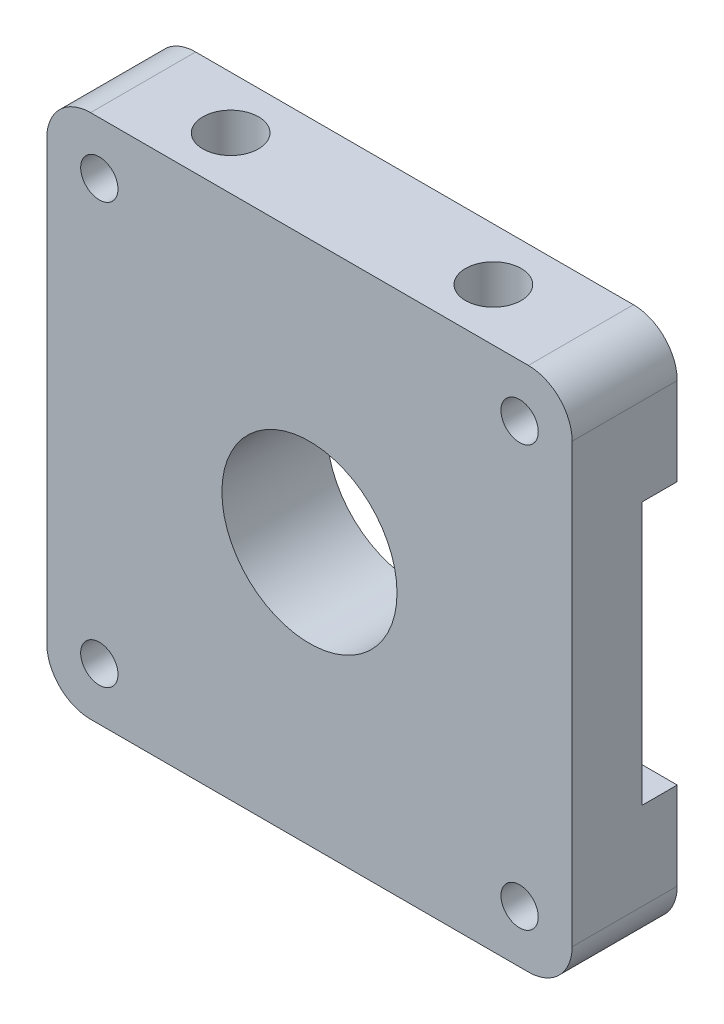
ISO-10303-21;
HEADER;
FILE_DESCRIPTION(('STEP AP214'),'2;1');
FILE_NAME('part.step','',(''),(''),'','','');
FILE_SCHEMA(('AUTOMOTIVE_DESIGN { 1 0 10303 214 1 1 1 1 }'));
ENDSEC;
DATA;
#1=APPLICATION_CONTEXT('core data for automotive mechanical design processes');
#2=APPLICATION_PROTOCOL_DEFINITION('international standard','automotive_design',2000,#1);
#3=PRODUCT_CONTEXT('',#1,'mechanical');
#4=PRODUCT('Part','Part','',(#3));
#5=PRODUCT_RELATED_PRODUCT_CATEGORY('part','',(#4));
#6=PRODUCT_DEFINITION_FORMATION('','',#4);
#7=PRODUCT_DEFINITION_CONTEXT('part definition',#1,'design');
#8=PRODUCT_DEFINITION('design','',#6,#7);
#9=PRODUCT_DEFINITION_SHAPE('','',#8);
#10=(LENGTH_UNIT() NAMED_UNIT(*) SI_UNIT(.MILLI.,.METRE.));
#11=(NAMED_UNIT(*) PLANE_ANGLE_UNIT() SI_UNIT($,.RADIAN.));
#12=(NAMED_UNIT(*) SI_UNIT($,.STERADIAN.) SOLID_ANGLE_UNIT());
#13=UNCERTAINTY_MEASURE_WITH_UNIT(LENGTH_MEASURE(1.E-05),#10,'distance_accuracy_value','');
#14=(GEOMETRIC_REPRESENTATION_CONTEXT(3) GLOBAL_UNCERTAINTY_ASSIGNED_CONTEXT((#13)) GLOBAL_UNIT_ASSIGNED_CONTEXT((#10,
#11,#12)) REPRESENTATION_CONTEXT('',''));
#15=CARTESIAN_POINT('',(0.,0.,0.));
#16=DIRECTION('',(0.,0.,1.));
#17=DIRECTION('',(1.,0.,0.));
#18=AXIS2_PLACEMENT_3D('',#15,#16,#17);
#19=CARTESIAN_POINT('',(9.525,10.16,3.81));
#20=DIRECTION('',(0.,1.,0.));
#21=DIRECTION('',(-1.,0.,0.));
#22=AXIS2_PLACEMENT_3D('',#19,#20,#21);
#23=PLANE('',#22);
#24=CARTESIAN_POINT('',(9.525,10.16,3.81));
#25=DIRECTION('',(0.,1.,0.));
#26=DIRECTION('',(-1.,0.,0.));
#27=AXIS2_PLACEMENT_3D('',#24,#25,#26);
#28=CIRCLE('',#27,2.0193);
#29=CARTESIAN_POINT('',(7.5057,10.16,3.81));
#30=VERTEX_POINT('',#29);
#31=EDGE_CURVE('E20',#30,#30,#28,.T.);
#32=ORIENTED_EDGE('',*,*,#31,.T.);
#33=EDGE_LOOP('',(#32));
#34=FACE_BOUND('',#33,.T.);
#35=ADVANCED_FACE('F17',(#34),#23,.T.);
#36=CARTESIAN_POINT('',(-9.525,10.16,3.81));
#37=DIRECTION('',(0.,1.,0.));
#38=DIRECTION('',(-1.,0.,0.));
#39=AXIS2_PLACEMENT_3D('',#36,#37,#38);
#40=PLANE('',#39);
#41=CARTESIAN_POINT('',(-9.525,10.16,3.81));
#42=DIRECTION('',(0.,1.,0.));
#43=DIRECTION('',(-1.,0.,0.));
#44=AXIS2_PLACEMENT_3D('',#41,#42,#43);
#45=CIRCLE('',#44,2.0193);
#46=CARTESIAN_POINT('',(-11.5443,10.16,3.81));
#47=VERTEX_POINT('',#46);
#48=EDGE_CURVE('E187',#47,#47,#45,.T.);
#49=ORIENTED_EDGE('',*,*,#48,.T.);
#50=EDGE_LOOP('',(#49));
#51=FACE_BOUND('',#50,.T.);
#52=ADVANCED_FACE('F567',(#51),#40,.T.);
#53=CARTESIAN_POINT('',(-9.525,-10.16,3.81));
#54=DIRECTION('',(0.,-1.,0.));
#55=DIRECTION('',(1.,0.,0.));
#56=AXIS2_PLACEMENT_3D('',#53,#54,#55);
#57=PLANE('',#56);
#58=CARTESIAN_POINT('',(-9.525,-10.16,3.81));
#59=DIRECTION('',(0.,-1.,0.));
#60=DIRECTION('',(1.,0.,0.));
#61=AXIS2_PLACEMENT_3D('',#58,#59,#60);
#62=CIRCLE('',#61,2.0193);
#63=CARTESIAN_POINT('',(-7.5057,-10.16,3.81));
#64=VERTEX_POINT('',#63);
#65=EDGE_CURVE('E174',#64,#64,#62,.T.);
#66=ORIENTED_EDGE('',*,*,#65,.T.);
#67=EDGE_LOOP('',(#66));
#68=FACE_BOUND('',#67,.T.);
#69=ADVANCED_FACE('F564',(#68),#57,.T.);
#70=CARTESIAN_POINT('',(9.525,-10.16,3.81));
#71=DIRECTION('',(0.,-1.,0.));
#72=DIRECTION('',(1.,0.,0.));
#73=AXIS2_PLACEMENT_3D('',#70,#71,#72);
#74=PLANE('',#73);
#75=CARTESIAN_POINT('',(9.525,-10.16,3.81));
#76=DIRECTION('',(0.,-1.,0.));
#77=DIRECTION('',(1.,0.,0.));
#78=AXIS2_PLACEMENT_3D('',#75,#76,#77);
#79=CIRCLE('',#78,2.0193);
#80=CARTESIAN_POINT('',(11.5443,-10.16,3.81));
#81=VERTEX_POINT('',#80);
#82=EDGE_CURVE('E170',#81,#81,#79,.T.);
#83=ORIENTED_EDGE('',*,*,#82,.T.);
#84=EDGE_LOOP('',(#83));
#85=FACE_BOUND('',#84,.T.);
#86=ADVANCED_FACE('F561',(#85),#74,.T.);
#87=CARTESIAN_POINT('',(0.,0.,2.54));
#88=DIRECTION('',(0.,0.,-1.));
#89=DIRECTION('',(-1.,0.,0.));
#90=AXIS2_PLACEMENT_3D('',#87,#88,#89);
#91=CYLINDRICAL_SURFACE('',#90,9.525);
#92=CARTESIAN_POINT('',(0.,0.,0.));
#93=DIRECTION('',(0.,0.,-1.));
#94=DIRECTION('',(-1.,0.,0.));
#95=AXIS2_PLACEMENT_3D('',#92,#93,#94);
#96=CIRCLE('',#95,9.525);
#97=CARTESIAN_POINT('',(-7.76635081528961,5.51447368421053,0.));
#98=VERTEX_POINT('',#97);
#99=CARTESIAN_POINT('',(-7.76635081528961,-5.51447368421053,0.));
#100=VERTEX_POINT('',#99);
#101=EDGE_CURVE('E296',#98,#100,#96,.F.);
#102=ORIENTED_EDGE('',*,*,#101,.T.);
#103=DIRECTION('',(0.,0.,-1.));
#104=VECTOR('',#103,1.);
#105=CARTESIAN_POINT('',(-7.76635081528961,-5.51447368421052,2.54));
#106=LINE('',#105,#104);
#107=CARTESIAN_POINT('',(-7.76635081528961,-5.51447368421053,2.54));
#108=VERTEX_POINT('',#107);
#109=EDGE_CURVE('E207',#100,#108,#106,.F.);
#110=ORIENTED_EDGE('',*,*,#109,.T.);
#111=CARTESIAN_POINT('',(0.,0.,2.54));
#112=DIRECTION('',(0.,0.,-1.));
#113=DIRECTION('',(-1.,0.,0.));
#114=AXIS2_PLACEMENT_3D('',#111,#112,#113);
#115=CIRCLE('',#114,9.525);
#116=CARTESIAN_POINT('',(-7.76635081528961,5.51447368421053,2.54));
#117=VERTEX_POINT('',#116);
#118=EDGE_CURVE('E185',#108,#117,#115,.T.);
#119=ORIENTED_EDGE('',*,*,#118,.T.);
#120=DIRECTION('',(0.,0.,-1.));
#121=VECTOR('',#120,1.);
#122=CARTESIAN_POINT('',(-7.76635081528961,5.51447368421053,2.54));
#123=LINE('',#122,#121);
#124=EDGE_CURVE('E158',#117,#98,#123,.T.);
#125=ORIENTED_EDGE('',*,*,#124,.T.);
#126=EDGE_LOOP('',(#102,#110,#119,#125));
#127=FACE_BOUND('',#126,.T.);
#128=ADVANCED_FACE('F557',(#127),#91,.T.);
#129=CARTESIAN_POINT('',(-9.83737769936684,-6.985,2.54));
#130=DIRECTION('',(0.,0.,-1.));
#131=DIRECTION('',(-1.,0.,0.));
#132=AXIS2_PLACEMENT_3D('',#129,#130,#131);
#133=CYLINDRICAL_SURFACE('',#132,2.54);
#134=DIRECTION('',(0.,0.,-1.));
#135=VECTOR('',#134,1.);
#136=CARTESIAN_POINT('',(-9.83737769936684,-9.525,2.54));
#137=LINE('',#136,#135);
#138=CARTESIAN_POINT('',(-9.83737769936684,-9.525,0.));
#139=VERTEX_POINT('',#138);
#140=CARTESIAN_POINT('',(-9.83737769936684,-9.525,2.54));
#141=VERTEX_POINT('',#140);
#142=EDGE_CURVE('E186',#139,#141,#137,.F.);
#143=ORIENTED_EDGE('',*,*,#142,.T.);
#144=CARTESIAN_POINT('',(-9.83737769936684,-6.985,2.54));
#145=DIRECTION('',(0.,0.,-1.));
#146=DIRECTION('',(-1.,0.,0.));
#147=AXIS2_PLACEMENT_3D('',#144,#145,#146);
#148=CIRCLE('',#147,2.54);
#149=EDGE_CURVE('E178',#141,#108,#148,.F.);
#150=ORIENTED_EDGE('',*,*,#149,.T.);
#151=ORIENTED_EDGE('',*,*,#109,.F.);
#152=CARTESIAN_POINT('',(-9.83737769936684,-6.985,0.));
#153=DIRECTION('',(0.,0.,-1.));
#154=DIRECTION('',(-1.,0.,0.));
#155=AXIS2_PLACEMENT_3D('',#152,#153,#154);
#156=CIRCLE('',#155,2.54);
#157=EDGE_CURVE('E294',#100,#139,#156,.T.);
#158=ORIENTED_EDGE('',*,*,#157,.T.);
#159=EDGE_LOOP('',(#143,#150,#151,#158));
#160=FACE_BOUND('',#159,.T.);
#161=ADVANCED_FACE('F554',(#160),#133,.F.);
#162=CARTESIAN_POINT('',(9.83737769936684,-6.985,2.54));
#163=DIRECTION('',(0.,0.,-1.));
#164=DIRECTION('',(-1.,0.,0.));
#165=AXIS2_PLACEMENT_3D('',#162,#163,#164);
#166=CYLINDRICAL_SURFACE('',#165,2.54);
#167=CARTESIAN_POINT('',(9.83737769936684,-6.985,2.54));
#168=DIRECTION('',(0.,0.,-1.));
#169=DIRECTION('',(-1.,0.,0.));
#170=AXIS2_PLACEMENT_3D('',#167,#168,#169);
#171=CIRCLE('',#170,2.54);
#172=CARTESIAN_POINT('',(7.76635081528961,-5.51447368421053,2.54));
#173=VERTEX_POINT('',#172);
#174=CARTESIAN_POINT('',(9.83737769936684,-9.525,2.54));
#175=VERTEX_POINT('',#174);
#176=EDGE_CURVE('E137',#173,#175,#171,.F.);
#177=ORIENTED_EDGE('',*,*,#176,.T.);
#178=DIRECTION('',(0.,0.,-1.));
#179=VECTOR('',#178,1.);
#180=CARTESIAN_POINT('',(9.83737769936684,-9.525,2.54));
#181=LINE('',#180,#179);
#182=CARTESIAN_POINT('',(9.83737769936684,-9.525,0.));
#183=VERTEX_POINT('',#182);
#184=EDGE_CURVE('E173',#175,#183,#181,.T.);
#185=ORIENTED_EDGE('',*,*,#184,.T.);
#186=CARTESIAN_POINT('',(9.83737769936684,-6.985,0.));
#187=DIRECTION('',(0.,0.,-1.));
#188=DIRECTION('',(-1.,0.,0.));
#189=AXIS2_PLACEMENT_3D('',#186,#187,#188);
#190=CIRCLE('',#189,2.54);
#191=CARTESIAN_POINT('',(7.76635081528961,-5.51447368421053,0.));
#192=VERTEX_POINT('',#191);
#193=EDGE_CURVE('E154',#183,#192,#190,.T.);
#194=ORIENTED_EDGE('',*,*,#193,.T.);
#195=DIRECTION('',(0.,0.,-1.));
#196=VECTOR('',#195,1.);
#197=CARTESIAN_POINT('',(7.76635081528961,-5.51447368421052,2.54));
#198=LINE('',#197,#196);
#199=EDGE_CURVE('E151',#173,#192,#198,.T.);
#200=ORIENTED_EDGE('',*,*,#199,.F.);
#201=EDGE_LOOP('',(#177,#185,#194,#200));
#202=FACE_BOUND('',#201,.T.);
#203=ADVANCED_FACE('F152',(#202),#166,.F.);
#204=CARTESIAN_POINT('',(0.,0.,2.54));
#205=DIRECTION('',(0.,0.,-1.));
#206=DIRECTION('',(-1.,0.,0.));
#207=AXIS2_PLACEMENT_3D('',#204,#205,#206);
#208=CYLINDRICAL_SURFACE('',#207,9.525);
#209=CARTESIAN_POINT('',(0.,0.,2.54));
#210=DIRECTION('',(0.,0.,-1.));
#211=DIRECTION('',(-1.,0.,0.));
#212=AXIS2_PLACEMENT_3D('',#209,#210,#211);
#213=CIRCLE('',#212,9.525);
#214=CARTESIAN_POINT('',(7.76635081528961,5.51447368421053,2.54));
#215=VERTEX_POINT('',#214);
#216=EDGE_CURVE('E143',#215,#173,#213,.T.);
#217=ORIENTED_EDGE('',*,*,#216,.T.);
#218=ORIENTED_EDGE('',*,*,#199,.T.);
#219=CARTESIAN_POINT('',(0.,0.,0.));
#220=DIRECTION('',(0.,0.,-1.));
#221=DIRECTION('',(-1.,0.,0.));
#222=AXIS2_PLACEMENT_3D('',#219,#220,#221);
#223=CIRCLE('',#222,9.525);
#224=CARTESIAN_POINT('',(7.76635081528961,5.51447368421053,0.));
#225=VERTEX_POINT('',#224);
#226=EDGE_CURVE('E290',#192,#225,#223,.F.);
#227=ORIENTED_EDGE('',*,*,#226,.T.);
#228=DIRECTION('',(0.,0.,-1.));
#229=VECTOR('',#228,1.);
#230=CARTESIAN_POINT('',(7.76635081528961,5.51447368421053,2.54));
#231=LINE('',#230,#229);
#232=EDGE_CURVE('E159',#225,#215,#231,.F.);
#233=ORIENTED_EDGE('',*,*,#232,.T.);
#234=EDGE_LOOP('',(#217,#218,#227,#233));
#235=FACE_BOUND('',#234,.T.);
#236=ADVANCED_FACE('F162',(#235),#208,.T.);
#237=CARTESIAN_POINT('',(9.83737769936684,6.985,2.54));
#238=DIRECTION('',(0.,0.,-1.));
#239=DIRECTION('',(-1.,0.,0.));
#240=AXIS2_PLACEMENT_3D('',#237,#238,#239);
#241=CYLINDRICAL_SURFACE('',#240,2.54);
#242=CARTESIAN_POINT('',(9.83737769936684,6.985,2.54));
#243=DIRECTION('',(0.,0.,-1.));
#244=DIRECTION('',(-1.,0.,0.));
#245=AXIS2_PLACEMENT_3D('',#242,#243,#244);
#246=CIRCLE('',#245,2.54);
#247=CARTESIAN_POINT('',(9.83737769936684,9.525,2.54));
#248=VERTEX_POINT('',#247);
#249=EDGE_CURVE('E164',#248,#215,#246,.F.);
#250=ORIENTED_EDGE('',*,*,#249,.T.);
#251=ORIENTED_EDGE('',*,*,#232,.F.);
#252=CARTESIAN_POINT('',(9.83737769936684,6.985,0.));
#253=DIRECTION('',(0.,0.,-1.));
#254=DIRECTION('',(-1.,0.,0.));
#255=AXIS2_PLACEMENT_3D('',#252,#253,#254);
#256=CIRCLE('',#255,2.54);
#257=CARTESIAN_POINT('',(9.83737769936684,9.525,0.));
#258=VERTEX_POINT('',#257);
#259=EDGE_CURVE('E287',#225,#258,#256,.T.);
#260=ORIENTED_EDGE('',*,*,#259,.T.);
#261=DIRECTION('',(0.,0.,1.));
#262=VECTOR('',#261,1.);
#263=CARTESIAN_POINT('',(9.83737769936684,9.525,2.54));
#264=LINE('',#263,#262);
#265=EDGE_CURVE('E166',#258,#248,#264,.T.);
#266=ORIENTED_EDGE('',*,*,#265,.T.);
#267=EDGE_LOOP('',(#250,#251,#260,#266));
#268=FACE_BOUND('',#267,.T.);
#269=ADVANCED_FACE('F413',(#268),#241,.F.);
#270=CARTESIAN_POINT('',(-9.83737769936684,6.985,2.54));
#271=DIRECTION('',(0.,0.,-1.));
#272=DIRECTION('',(-1.,0.,0.));
#273=AXIS2_PLACEMENT_3D('',#270,#271,#272);
#274=CYLINDRICAL_SURFACE('',#273,2.54);
#275=ORIENTED_EDGE('',*,*,#124,.F.);
#276=CARTESIAN_POINT('',(-9.83737769936684,6.985,2.54));
#277=DIRECTION('',(0.,0.,-1.));
#278=DIRECTION('',(-1.,0.,0.));
#279=AXIS2_PLACEMENT_3D('',#276,#277,#278);
#280=CIRCLE('',#279,2.54);
#281=CARTESIAN_POINT('',(-9.83737769936684,9.525,2.54));
#282=VERTEX_POINT('',#281);
#283=EDGE_CURVE('E183',#117,#282,#280,.F.);
#284=ORIENTED_EDGE('',*,*,#283,.T.);
#285=DIRECTION('',(0.,0.,1.));
#286=VECTOR('',#285,1.);
#287=CARTESIAN_POINT('',(-9.83737769936684,9.525,2.54));
#288=LINE('',#287,#286);
#289=CARTESIAN_POINT('',(-9.83737769936684,9.525,0.));
#290=VERTEX_POINT('',#289);
#291=EDGE_CURVE('E177',#282,#290,#288,.F.);
#292=ORIENTED_EDGE('',*,*,#291,.T.);
#293=CARTESIAN_POINT('',(-9.83737769936684,6.985,0.));
#294=DIRECTION('',(0.,0.,-1.));
#295=DIRECTION('',(-1.,0.,0.));
#296=AXIS2_PLACEMENT_3D('',#293,#294,#295);
#297=CIRCLE('',#296,2.54);
#298=EDGE_CURVE('E284',#290,#98,#297,.T.);
#299=ORIENTED_EDGE('',*,*,#298,.T.);
#300=EDGE_LOOP('',(#275,#284,#292,#299));
#301=FACE_BOUND('',#300,.T.);
#302=ADVANCED_FACE('F543',(#301),#274,.F.);
#303=CARTESIAN_POINT('',(9.525,10.16,3.81));
#304=DIRECTION('',(0.,1.,0.));
#305=DIRECTION('',(-1.,0.,0.));
#306=AXIS2_PLACEMENT_3D('',#303,#304,#305);
#307=CYLINDRICAL_SURFACE('',#306,2.0193);
#308=ORIENTED_EDGE('',*,*,#31,.F.);
#309=EDGE_LOOP('',(#308));
#310=FACE_BOUND('',#309,.T.);
#311=CARTESIAN_POINT('',(9.525,19.05,3.81));
#312=DIRECTION('',(0.,1.,0.));
#313=DIRECTION('',(-1.,0.,0.));
#314=AXIS2_PLACEMENT_3D('',#311,#312,#313);
#315=CIRCLE('',#314,2.0193);
#316=CARTESIAN_POINT('',(7.5057,19.05,3.81));
#317=VERTEX_POINT('',#316);
#318=EDGE_CURVE('E266',#317,#317,#315,.T.);
#319=ORIENTED_EDGE('',*,*,#318,.T.);
#320=EDGE_LOOP('',(#319));
#321=FACE_BOUND('',#320,.T.);
#322=ADVANCED_FACE('F539',(#310,#321),#307,.F.);
#323=CARTESIAN_POINT('',(-9.525,10.16,3.81));
#324=DIRECTION('',(0.,1.,0.));
#325=DIRECTION('',(-1.,0.,0.));
#326=AXIS2_PLACEMENT_3D('',#323,#324,#325);
#327=CYLINDRICAL_SURFACE('',#326,2.0193);
#328=ORIENTED_EDGE('',*,*,#48,.F.);
#329=EDGE_LOOP('',(#328));
#330=FACE_BOUND('',#329,.T.);
#331=CARTESIAN_POINT('',(-9.525,19.05,3.81));
#332=DIRECTION('',(0.,1.,0.));
#333=DIRECTION('',(-1.,0.,0.));
#334=AXIS2_PLACEMENT_3D('',#331,#332,#333);
#335=CIRCLE('',#334,2.0193);
#336=CARTESIAN_POINT('',(-11.5443,19.05,3.81));
#337=VERTEX_POINT('',#336);
#338=EDGE_CURVE('E263',#337,#337,#335,.T.);
#339=ORIENTED_EDGE('',*,*,#338,.T.);
#340=EDGE_LOOP('',(#339));
#341=FACE_BOUND('',#340,.T.);
#342=ADVANCED_FACE('F536',(#330,#341),#327,.F.);
#343=CARTESIAN_POINT('',(-19.05,-9.525,2.54));
#344=DIRECTION('',(0.,-1.,0.));
#345=DIRECTION('',(0.,0.,-1.));
#346=AXIS2_PLACEMENT_3D('',#343,#344,#345);
#347=PLANE('',#346);
#348=DIRECTION('',(0.,0.,-1.));
#349=VECTOR('',#348,1.);
#350=CARTESIAN_POINT('',(-19.05,-9.525,7.62));
#351=LINE('',#350,#349);
#352=CARTESIAN_POINT('',(-19.05,-9.525,0.));
#353=VERTEX_POINT('',#352);
#354=CARTESIAN_POINT('',(-19.05,-9.525,2.54));
#355=VERTEX_POINT('',#354);
#356=EDGE_CURVE('E337',#353,#355,#351,.F.);
#357=ORIENTED_EDGE('',*,*,#356,.T.);
#358=DIRECTION('',(1.,0.,0.));
#359=VECTOR('',#358,1.);
#360=CARTESIAN_POINT('',(-9.83737769936684,-9.525,2.54));
#361=LINE('',#360,#359);
#362=EDGE_CURVE('E182',#355,#141,#361,.T.);
#363=ORIENTED_EDGE('',*,*,#362,.T.);
#364=ORIENTED_EDGE('',*,*,#142,.F.);
#365=DIRECTION('',(1.,0.,0.));
#366=VECTOR('',#365,1.);
#367=CARTESIAN_POINT('',(0.,-9.525,0.));
#368=LINE('',#367,#366);
#369=EDGE_CURVE('E295',#139,#353,#368,.F.);
#370=ORIENTED_EDGE('',*,*,#369,.T.);
#371=EDGE_LOOP('',(#357,#363,#364,#370));
#372=FACE_BOUND('',#371,.T.);
#373=ADVANCED_FACE('F367',(#372),#347,.F.);
#374=CARTESIAN_POINT('',(-9.83737769936684,-6.985,2.54));
#375=DIRECTION('',(0.,0.,1.));
#376=DIRECTION('',(1.,0.,0.));
#377=AXIS2_PLACEMENT_3D('',#374,#375,#376);
#378=PLANE('',#377);
#379=ORIENTED_EDGE('',*,*,#362,.F.);
#380=DIRECTION('',(0.,1.,0.));
#381=VECTOR('',#380,1.);
#382=CARTESIAN_POINT('',(-19.05,-42.0514213562373,2.54));
#383=LINE('',#382,#381);
#384=CARTESIAN_POINT('',(-19.05,9.525,2.54));
#385=VERTEX_POINT('',#384);
#386=EDGE_CURVE('E348',#355,#385,#383,.T.);
#387=ORIENTED_EDGE('',*,*,#386,.T.);
#388=DIRECTION('',(1.,0.,0.));
#389=VECTOR('',#388,1.);
#390=CARTESIAN_POINT('',(-19.05,9.525,2.54));
#391=LINE('',#390,#389);
#392=EDGE_CURVE('E181',#385,#282,#391,.T.);
#393=ORIENTED_EDGE('',*,*,#392,.T.);
#394=ORIENTED_EDGE('',*,*,#283,.F.);
#395=ORIENTED_EDGE('',*,*,#118,.F.);
#396=ORIENTED_EDGE('',*,*,#149,.F.);
#397=EDGE_LOOP('',(#379,#387,#393,#394,#395,#396));
#398=FACE_BOUND('',#397,.T.);
#399=ADVANCED_FACE('F376',(#398),#378,.F.);
#400=CARTESIAN_POINT('',(-19.05,9.525,2.54));
#401=DIRECTION('',(0.,1.,0.));
#402=DIRECTION('',(0.,0.,1.));
#403=AXIS2_PLACEMENT_3D('',#400,#401,#402);
#404=PLANE('',#403);
#405=ORIENTED_EDGE('',*,*,#291,.F.);
#406=ORIENTED_EDGE('',*,*,#392,.F.);
#407=DIRECTION('',(0.,0.,-1.));
#408=VECTOR('',#407,1.);
#409=CARTESIAN_POINT('',(-19.05,9.525,7.62));
#410=LINE('',#409,#408);
#411=CARTESIAN_POINT('',(-19.05,9.525,0.));
#412=VERTEX_POINT('',#411);
#413=EDGE_CURVE('E343',#385,#412,#410,.T.);
#414=ORIENTED_EDGE('',*,*,#413,.T.);
#415=DIRECTION('',(1.,0.,0.));
#416=VECTOR('',#415,1.);
#417=CARTESIAN_POINT('',(0.,9.525,0.));
#418=LINE('',#417,#416);
#419=EDGE_CURVE('E286',#412,#290,#418,.T.);
#420=ORIENTED_EDGE('',*,*,#419,.T.);
#421=EDGE_LOOP('',(#405,#406,#414,#420));
#422=FACE_BOUND('',#421,.T.);
#423=ADVANCED_FACE('F386',(#422),#404,.F.);
#424=CARTESIAN_POINT('',(-9.525,-10.16,3.81));
#425=DIRECTION('',(0.,-1.,0.));
#426=DIRECTION('',(1.,0.,0.));
#427=AXIS2_PLACEMENT_3D('',#424,#425,#426);
#428=CYLINDRICAL_SURFACE('',#427,2.0193);
#429=ORIENTED_EDGE('',*,*,#65,.F.);
#430=EDGE_LOOP('',(#429));
#431=FACE_BOUND('',#430,.T.);
#432=CARTESIAN_POINT('',(-9.525,-19.05,3.81));
#433=DIRECTION('',(0.,-1.,0.));
#434=DIRECTION('',(1.,0.,0.));
#435=AXIS2_PLACEMENT_3D('',#432,#433,#434);
#436=CIRCLE('',#435,2.0193);
#437=CARTESIAN_POINT('',(-7.5057,-19.05,3.81));
#438=VERTEX_POINT('',#437);
#439=EDGE_CURVE('E252',#438,#438,#436,.T.);
#440=ORIENTED_EDGE('',*,*,#439,.T.);
#441=EDGE_LOOP('',(#440));
#442=FACE_BOUND('',#441,.T.);
#443=ADVANCED_FACE('F525',(#431,#442),#428,.F.);
#444=CARTESIAN_POINT('',(9.525,-10.16,3.81));
#445=DIRECTION('',(0.,-1.,0.));
#446=DIRECTION('',(1.,0.,0.));
#447=AXIS2_PLACEMENT_3D('',#444,#445,#446);
#448=CYLINDRICAL_SURFACE('',#447,2.0193);
#449=ORIENTED_EDGE('',*,*,#82,.F.);
#450=EDGE_LOOP('',(#449));
#451=FACE_BOUND('',#450,.T.);
#452=CARTESIAN_POINT('',(9.525,-19.05,3.81));
#453=DIRECTION('',(0.,-1.,0.));
#454=DIRECTION('',(1.,0.,0.));
#455=AXIS2_PLACEMENT_3D('',#452,#453,#454);
#456=CIRCLE('',#455,2.0193);
#457=CARTESIAN_POINT('',(11.5443,-19.05,3.81));
#458=VERTEX_POINT('',#457);
#459=EDGE_CURVE('E248',#458,#458,#456,.T.);
#460=ORIENTED_EDGE('',*,*,#459,.T.);
#461=EDGE_LOOP('',(#460));
#462=FACE_BOUND('',#461,.T.);
#463=ADVANCED_FACE('F522',(#451,#462),#448,.F.);
#464=CARTESIAN_POINT('',(19.05,-9.525,2.54));
#465=DIRECTION('',(0.,-1.,0.));
#466=DIRECTION('',(0.,0.,-1.));
#467=AXIS2_PLACEMENT_3D('',#464,#465,#466);
#468=PLANE('',#467);
#469=ORIENTED_EDGE('',*,*,#184,.F.);
#470=DIRECTION('',(1.,0.,0.));
#471=VECTOR('',#470,1.);
#472=CARTESIAN_POINT('',(9.83737769936684,-9.525,2.54));
#473=LINE('',#472,#471);
#474=CARTESIAN_POINT('',(19.05,-9.525,2.54));
#475=VERTEX_POINT('',#474);
#476=EDGE_CURVE('E145',#175,#475,#473,.T.);
#477=ORIENTED_EDGE('',*,*,#476,.T.);
#478=DIRECTION('',(0.,0.,1.));
#479=VECTOR('',#478,1.);
#480=CARTESIAN_POINT('',(19.05,-9.525,7.62));
#481=LINE('',#480,#479);
#482=CARTESIAN_POINT('',(19.05,-9.525,0.));
#483=VERTEX_POINT('',#482);
#484=EDGE_CURVE('E322',#475,#483,#481,.F.);
#485=ORIENTED_EDGE('',*,*,#484,.T.);
#486=DIRECTION('',(1.,0.,0.));
#487=VECTOR('',#486,1.);
#488=CARTESIAN_POINT('',(0.,-9.525,0.));
#489=LINE('',#488,#487);
#490=EDGE_CURVE('E293',#483,#183,#489,.F.);
#491=ORIENTED_EDGE('',*,*,#490,.T.);
#492=EDGE_LOOP('',(#469,#477,#485,#491));
#493=FACE_BOUND('',#492,.T.);
#494=ADVANCED_FACE('F407',(#493),#468,.F.);
#495=CARTESIAN_POINT('',(19.05,9.525,2.54));
#496=DIRECTION('',(0.,1.,0.));
#497=DIRECTION('',(0.,0.,1.));
#498=AXIS2_PLACEMENT_3D('',#495,#496,#497);
#499=PLANE('',#498);
#500=DIRECTION('',(0.,0.,1.));
#501=VECTOR('',#500,1.);
#502=CARTESIAN_POINT('',(19.05,9.525,7.62));
#503=LINE('',#502,#501);
#504=CARTESIAN_POINT('',(19.05,9.525,0.));
#505=VERTEX_POINT('',#504);
#506=CARTESIAN_POINT('',(19.05,9.525,2.54));
#507=VERTEX_POINT('',#506);
#508=EDGE_CURVE('E314',#505,#507,#503,.T.);
#509=ORIENTED_EDGE('',*,*,#508,.T.);
#510=DIRECTION('',(1.,0.,0.));
#511=VECTOR('',#510,1.);
#512=CARTESIAN_POINT('',(9.83737769936684,9.525,2.54));
#513=LINE('',#512,#511);
#514=EDGE_CURVE('E297',#507,#248,#513,.F.);
#515=ORIENTED_EDGE('',*,*,#514,.T.);
#516=ORIENTED_EDGE('',*,*,#265,.F.);
#517=DIRECTION('',(1.,0.,0.));
#518=VECTOR('',#517,1.);
#519=CARTESIAN_POINT('',(0.,9.525,0.));
#520=LINE('',#519,#518);
#521=EDGE_CURVE('E289',#258,#505,#520,.T.);
#522=ORIENTED_EDGE('',*,*,#521,.T.);
#523=EDGE_LOOP('',(#509,#515,#516,#522));
#524=FACE_BOUND('',#523,.T.);
#525=ADVANCED_FACE('F423',(#524),#499,.F.);
#526=CARTESIAN_POINT('',(9.83737769936684,6.985,2.54));
#527=DIRECTION('',(0.,0.,1.));
#528=DIRECTION('',(1.,0.,0.));
#529=AXIS2_PLACEMENT_3D('',#526,#527,#528);
#530=PLANE('',#529);
#531=DIRECTION('',(0.,-1.,0.));
#532=VECTOR('',#531,1.);
#533=CARTESIAN_POINT('',(19.05,-42.0514213562373,2.54));
#534=LINE('',#533,#532);
#535=EDGE_CURVE('E242',#507,#475,#534,.T.);
#536=ORIENTED_EDGE('',*,*,#535,.T.);
#537=ORIENTED_EDGE('',*,*,#476,.F.);
#538=ORIENTED_EDGE('',*,*,#176,.F.);
#539=ORIENTED_EDGE('',*,*,#216,.F.);
#540=ORIENTED_EDGE('',*,*,#249,.F.);
#541=ORIENTED_EDGE('',*,*,#514,.F.);
#542=EDGE_LOOP('',(#536,#537,#538,#539,#540,#541));
#543=FACE_BOUND('',#542,.T.);
#544=ADVANCED_FACE('F140',(#543),#530,.F.);
#545=CARTESIAN_POINT('',(0.,-42.0514213562373,0.));
#546=DIRECTION('',(0.,0.,1.));
#547=DIRECTION('',(1.,0.,0.));
#548=AXIS2_PLACEMENT_3D('',#545,#546,#547);
#549=PLANE('',#548);
#550=ORIENTED_EDGE('',*,*,#419,.F.);
#551=DIRECTION('',(0.,1.,0.));
#552=VECTOR('',#551,1.);
#553=CARTESIAN_POINT('',(-19.05,-42.0514213562373,0.));
#554=LINE('',#553,#552);
#555=CARTESIAN_POINT('',(-19.05,15.875,0.));
#556=VERTEX_POINT('',#555);
#557=EDGE_CURVE('E258',#412,#556,#554,.T.);
#558=ORIENTED_EDGE('',*,*,#557,.T.);
#559=CARTESIAN_POINT('',(-15.875,15.875,0.));
#560=DIRECTION('',(0.,0.,-1.));
#561=DIRECTION('',(-1.,0.,0.));
#562=AXIS2_PLACEMENT_3D('',#559,#560,#561);
#563=CIRCLE('',#562,3.17500000000001);
#564=CARTESIAN_POINT('',(-15.875,19.05,0.));
#565=VERTEX_POINT('',#564);
#566=EDGE_CURVE('E259',#565,#556,#563,.F.);
#567=ORIENTED_EDGE('',*,*,#566,.F.);
#568=DIRECTION('',(1.,0.,0.));
#569=VECTOR('',#568,1.);
#570=CARTESIAN_POINT('',(0.,19.05,0.));
#571=LINE('',#570,#569);
#572=CARTESIAN_POINT('',(15.875,19.05,0.));
#573=VERTEX_POINT('',#572);
#574=EDGE_CURVE('E262',#565,#573,#571,.T.);
#575=ORIENTED_EDGE('',*,*,#574,.T.);
#576=CARTESIAN_POINT('',(15.875,15.875,0.));
#577=DIRECTION('',(0.,0.,-1.));
#578=DIRECTION('',(-1.,0.,0.));
#579=AXIS2_PLACEMENT_3D('',#576,#577,#578);
#580=CIRCLE('',#579,3.175);
#581=CARTESIAN_POINT('',(19.05,15.875,0.));
#582=VERTEX_POINT('',#581);
#583=EDGE_CURVE('E238',#582,#573,#580,.F.);
#584=ORIENTED_EDGE('',*,*,#583,.F.);
#585=DIRECTION('',(0.,-1.,0.));
#586=VECTOR('',#585,1.);
#587=CARTESIAN_POINT('',(19.05,-42.0514213562373,0.));
#588=LINE('',#587,#586);
#589=EDGE_CURVE('E316',#582,#505,#588,.T.);
#590=ORIENTED_EDGE('',*,*,#589,.T.);
#591=ORIENTED_EDGE('',*,*,#521,.F.);
#592=ORIENTED_EDGE('',*,*,#259,.F.);
#593=ORIENTED_EDGE('',*,*,#226,.F.);
#594=ORIENTED_EDGE('',*,*,#193,.F.);
#595=ORIENTED_EDGE('',*,*,#490,.F.);
#596=DIRECTION('',(0.,-1.,0.));
#597=VECTOR('',#596,1.);
#598=CARTESIAN_POINT('',(19.05,-42.0514213562373,0.));
#599=LINE('',#598,#597);
#600=CARTESIAN_POINT('',(19.05,-15.875,0.));
#601=VERTEX_POINT('',#600);
#602=EDGE_CURVE('E319',#483,#601,#599,.T.);
#603=ORIENTED_EDGE('',*,*,#602,.T.);
#604=CARTESIAN_POINT('',(15.875,-15.875,0.));
#605=DIRECTION('',(0.,0.,-1.));
#606=DIRECTION('',(-1.,0.,0.));
#607=AXIS2_PLACEMENT_3D('',#604,#605,#606);
#608=CIRCLE('',#607,3.175);
#609=CARTESIAN_POINT('',(15.875,-19.05,0.));
#610=VERTEX_POINT('',#609);
#611=EDGE_CURVE('E243',#610,#601,#608,.F.);
#612=ORIENTED_EDGE('',*,*,#611,.F.);
#613=DIRECTION('',(-1.,0.,0.));
#614=VECTOR('',#613,1.);
#615=CARTESIAN_POINT('',(0.,-19.05,0.));
#616=LINE('',#615,#614);
#617=CARTESIAN_POINT('',(-15.875,-19.05,0.));
#618=VERTEX_POINT('',#617);
#619=EDGE_CURVE('E247',#610,#618,#616,.T.);
#620=ORIENTED_EDGE('',*,*,#619,.T.);
#621=CARTESIAN_POINT('',(-15.875,-15.875,0.));
#622=DIRECTION('',(0.,0.,-1.));
#623=DIRECTION('',(-1.,0.,0.));
#624=AXIS2_PLACEMENT_3D('',#621,#622,#623);
#625=CIRCLE('',#624,3.175);
#626=CARTESIAN_POINT('',(-19.05,-15.875,0.));
#627=VERTEX_POINT('',#626);
#628=EDGE_CURVE('E256',#627,#618,#625,.F.);
#629=ORIENTED_EDGE('',*,*,#628,.F.);
#630=DIRECTION('',(0.,1.,0.));
#631=VECTOR('',#630,1.);
#632=CARTESIAN_POINT('',(-19.05,-42.0514213562373,0.));
#633=LINE('',#632,#631);
#634=EDGE_CURVE('E334',#627,#353,#633,.T.);
#635=ORIENTED_EDGE('',*,*,#634,.T.);
#636=ORIENTED_EDGE('',*,*,#369,.F.);
#637=ORIENTED_EDGE('',*,*,#157,.F.);
#638=ORIENTED_EDGE('',*,*,#101,.F.);
#639=ORIENTED_EDGE('',*,*,#298,.F.);
#640=EDGE_LOOP('',(#550,#558,#567,#575,#584,#590,#591,#592,#593,#594,#595,#603,#612,#620,#629,
#635,#636,#637,#638,#639));
#641=FACE_BOUND('',#640,.T.);
#642=CARTESIAN_POINT('',(0.,0.,0.));
#643=DIRECTION('',(0.,0.,-1.));
#644=DIRECTION('',(-1.,0.,0.));
#645=AXIS2_PLACEMENT_3D('',#642,#643,#644);
#646=CIRCLE('',#645,6.35);
#647=CARTESIAN_POINT('',(-6.35,0.,0.));
#648=VERTEX_POINT('',#647);
#649=EDGE_CURVE('E269',#648,#648,#646,.F.);
#650=ORIENTED_EDGE('',*,*,#649,.T.);
#651=EDGE_LOOP('',(#650));
#652=FACE_BOUND('',#651,.T.);
#653=CARTESIAN_POINT('',(-15.24,15.24,0.));
#654=DIRECTION('',(0.,0.,1.));
#655=DIRECTION('',(1.,0.,0.));
#656=AXIS2_PLACEMENT_3D('',#653,#654,#655);
#657=CIRCLE('',#656,1.35255);
#658=CARTESIAN_POINT('',(-13.88745,15.24,0.));
#659=VERTEX_POINT('',#658);
#660=EDGE_CURVE('E272',#659,#659,#657,.T.);
#661=ORIENTED_EDGE('',*,*,#660,.T.);
#662=EDGE_LOOP('',(#661));
#663=FACE_BOUND('',#662,.T.);
#664=CARTESIAN_POINT('',(15.24,15.24,0.));
#665=DIRECTION('',(0.,0.,1.));
#666=DIRECTION('',(1.,0.,0.));
#667=AXIS2_PLACEMENT_3D('',#664,#665,#666);
#668=CIRCLE('',#667,1.35255);
#669=CARTESIAN_POINT('',(16.59255,15.24,0.));
#670=VERTEX_POINT('',#669);
#671=EDGE_CURVE('E275',#670,#670,#668,.T.);
#672=ORIENTED_EDGE('',*,*,#671,.T.);
#673=EDGE_LOOP('',(#672));
#674=FACE_BOUND('',#673,.T.);
#675=CARTESIAN_POINT('',(15.2400000000003,-15.2399999999997,0.));
#676=DIRECTION('',(0.,0.,1.));
#677=DIRECTION('',(1.,0.,0.));
#678=AXIS2_PLACEMENT_3D('',#675,#676,#677);
#679=CIRCLE('',#678,1.35255);
#680=CARTESIAN_POINT('',(16.5925500000003,-15.2399999999997,0.));
#681=VERTEX_POINT('',#680);
#682=EDGE_CURVE('E278',#681,#681,#679,.T.);
#683=ORIENTED_EDGE('',*,*,#682,.T.);
#684=EDGE_LOOP('',(#683));
#685=FACE_BOUND('',#684,.T.);
#686=CARTESIAN_POINT('',(-15.24,-15.24,0.));
#687=DIRECTION('',(0.,0.,1.));
#688=DIRECTION('',(1.,0.,0.));
#689=AXIS2_PLACEMENT_3D('',#686,#687,#688);
#690=CIRCLE('',#689,1.35255);
#691=CARTESIAN_POINT('',(-13.88745,-15.24,0.));
#692=VERTEX_POINT('',#691);
#693=EDGE_CURVE('E281',#692,#692,#690,.T.);
#694=ORIENTED_EDGE('',*,*,#693,.T.);
#695=EDGE_LOOP('',(#694));
#696=FACE_BOUND('',#695,.T.);
#697=ADVANCED_FACE('F390',(#641,#652,#663,#674,#685,#696),#549,.F.);
#698=CARTESIAN_POINT('',(-15.24,-15.24,0.));
#699=DIRECTION('',(0.,0.,1.));
#700=DIRECTION('',(1.,0.,0.));
#701=AXIS2_PLACEMENT_3D('',#698,#699,#700);
#702=CYLINDRICAL_SURFACE('',#701,1.35255);
#703=CARTESIAN_POINT('',(-15.24,-15.24,7.62));
#704=DIRECTION('',(0.,0.,1.));
#705=DIRECTION('',(1.,0.,0.));
#706=AXIS2_PLACEMENT_3D('',#703,#704,#705);
#707=CIRCLE('',#706,1.35255);
#708=CARTESIAN_POINT('',(-13.88745,-15.24,7.62));
#709=VERTEX_POINT('',#708);
#710=EDGE_CURVE('E235',#709,#709,#707,.F.);
#711=ORIENTED_EDGE('',*,*,#710,.F.);
#712=EDGE_LOOP('',(#711));
#713=FACE_BOUND('',#712,.T.);
#714=ORIENTED_EDGE('',*,*,#693,.F.);
#715=EDGE_LOOP('',(#714));
#716=FACE_BOUND('',#715,.T.);
#717=ADVANCED_FACE('F509',(#713,#716),#702,.F.);
#718=CARTESIAN_POINT('',(15.2400000000003,-15.2399999999997,0.));
#719=DIRECTION('',(0.,0.,1.));
#720=DIRECTION('',(1.,0.,0.));
#721=AXIS2_PLACEMENT_3D('',#718,#719,#720);
#722=CYLINDRICAL_SURFACE('',#721,1.35255);
#723=CARTESIAN_POINT('',(15.2400000000003,-15.2399999999997,7.62));
#724=DIRECTION('',(0.,0.,1.));
#725=DIRECTION('',(1.,0.,0.));
#726=AXIS2_PLACEMENT_3D('',#723,#724,#725);
#727=CIRCLE('',#726,1.35255);
#728=CARTESIAN_POINT('',(16.5925500000003,-15.2399999999997,7.62));
#729=VERTEX_POINT('',#728);
#730=EDGE_CURVE('E232',#729,#729,#727,.F.);
#731=ORIENTED_EDGE('',*,*,#730,.F.);
#732=EDGE_LOOP('',(#731));
#733=FACE_BOUND('',#732,.T.);
#734=ORIENTED_EDGE('',*,*,#682,.F.);
#735=EDGE_LOOP('',(#734));
#736=FACE_BOUND('',#735,.T.);
#737=ADVANCED_FACE('F505',(#733,#736),#722,.F.);
#738=CARTESIAN_POINT('',(15.24,15.24,0.));
#739=DIRECTION('',(0.,0.,1.));
#740=DIRECTION('',(1.,0.,0.));
#741=AXIS2_PLACEMENT_3D('',#738,#739,#740);
#742=CYLINDRICAL_SURFACE('',#741,1.35255);
#743=CARTESIAN_POINT('',(15.24,15.24,7.62));
#744=DIRECTION('',(0.,0.,1.));
#745=DIRECTION('',(1.,0.,0.));
#746=AXIS2_PLACEMENT_3D('',#743,#744,#745);
#747=CIRCLE('',#746,1.35255);
#748=CARTESIAN_POINT('',(16.59255,15.24,7.62));
#749=VERTEX_POINT('',#748);
#750=EDGE_CURVE('E229',#749,#749,#747,.F.);
#751=ORIENTED_EDGE('',*,*,#750,.F.);
#752=EDGE_LOOP('',(#751));
#753=FACE_BOUND('',#752,.T.);
#754=ORIENTED_EDGE('',*,*,#671,.F.);
#755=EDGE_LOOP('',(#754));
#756=FACE_BOUND('',#755,.T.);
#757=ADVANCED_FACE('F501',(#753,#756),#742,.F.);
#758=CARTESIAN_POINT('',(-15.24,15.24,0.));
#759=DIRECTION('',(0.,0.,1.));
#760=DIRECTION('',(1.,0.,0.));
#761=AXIS2_PLACEMENT_3D('',#758,#759,#760);
#762=CYLINDRICAL_SURFACE('',#761,1.35255);
#763=CARTESIAN_POINT('',(-15.24,15.24,7.62));
#764=DIRECTION('',(0.,0.,1.));
#765=DIRECTION('',(1.,0.,0.));
#766=AXIS2_PLACEMENT_3D('',#763,#764,#765);
#767=CIRCLE('',#766,1.35255);
#768=CARTESIAN_POINT('',(-13.88745,15.24,7.62));
#769=VERTEX_POINT('',#768);
#770=EDGE_CURVE('E226',#769,#769,#767,.F.);
#771=ORIENTED_EDGE('',*,*,#770,.F.);
#772=EDGE_LOOP('',(#771));
#773=FACE_BOUND('',#772,.T.);
#774=ORIENTED_EDGE('',*,*,#660,.F.);
#775=EDGE_LOOP('',(#774));
#776=FACE_BOUND('',#775,.T.);
#777=ADVANCED_FACE('F497',(#773,#776),#762,.F.);
#778=CARTESIAN_POINT('',(0.,0.,7.62));
#779=DIRECTION('',(0.,0.,-1.));
#780=DIRECTION('',(-1.,0.,0.));
#781=AXIS2_PLACEMENT_3D('',#778,#779,#780);
#782=CYLINDRICAL_SURFACE('',#781,6.35);
#783=CARTESIAN_POINT('',(0.,0.,7.62));
#784=DIRECTION('',(0.,0.,-1.));
#785=DIRECTION('',(-1.,0.,0.));
#786=AXIS2_PLACEMENT_3D('',#783,#784,#785);
#787=CIRCLE('',#786,6.35);
#788=CARTESIAN_POINT('',(-6.35,0.,7.62));
#789=VERTEX_POINT('',#788);
#790=EDGE_CURVE('E223',#789,#789,#787,.T.);
#791=ORIENTED_EDGE('',*,*,#790,.F.);
#792=EDGE_LOOP('',(#791));
#793=FACE_BOUND('',#792,.T.);
#794=ORIENTED_EDGE('',*,*,#649,.F.);
#795=EDGE_LOOP('',(#794));
#796=FACE_BOUND('',#795,.T.);
#797=ADVANCED_FACE('F494',(#793,#796),#782,.F.);
#798=CARTESIAN_POINT('',(0.,19.05,7.62));
#799=DIRECTION('',(0.,-1.,0.));
#800=DIRECTION('',(1.,0.,0.));
#801=AXIS2_PLACEMENT_3D('',#798,#799,#800);
#802=PLANE('',#801);
#803=DIRECTION('',(0.,0.,-1.));
#804=VECTOR('',#803,1.);
#805=CARTESIAN_POINT('',(-15.875,19.05,7.62));
#806=LINE('',#805,#804);
#807=CARTESIAN_POINT('',(-15.875,19.05,7.62));
#808=VERTEX_POINT('',#807);
#809=EDGE_CURVE('E261',#808,#565,#806,.T.);
#810=ORIENTED_EDGE('',*,*,#809,.F.);
#811=DIRECTION('',(1.,0.,0.));
#812=VECTOR('',#811,1.);
#813=CARTESIAN_POINT('',(0.,19.05,7.62));
#814=LINE('',#813,#812);
#815=CARTESIAN_POINT('',(15.875,19.05,7.62));
#816=VERTEX_POINT('',#815);
#817=EDGE_CURVE('E222',#816,#808,#814,.F.);
#818=ORIENTED_EDGE('',*,*,#817,.F.);
#819=DIRECTION('',(0.,0.,-1.));
#820=VECTOR('',#819,1.);
#821=CARTESIAN_POINT('',(15.875,19.05,7.62));
#822=LINE('',#821,#820);
#823=EDGE_CURVE('E241',#573,#816,#822,.F.);
#824=ORIENTED_EDGE('',*,*,#823,.F.);
#825=ORIENTED_EDGE('',*,*,#574,.F.);
#826=EDGE_LOOP('',(#810,#818,#824,#825));
#827=FACE_BOUND('',#826,.T.);
#828=ORIENTED_EDGE('',*,*,#338,.F.);
#829=EDGE_LOOP('',(#828));
#830=FACE_BOUND('',#829,.T.);
#831=ORIENTED_EDGE('',*,*,#318,.F.);
#832=EDGE_LOOP('',(#831));
#833=FACE_BOUND('',#832,.T.);
#834=ADVANCED_FACE('F468',(#827,#830,#833),#802,.F.);
#835=CARTESIAN_POINT('',(-15.875,15.875,7.62));
#836=DIRECTION('',(0.,0.,-1.));
#837=DIRECTION('',(-1.,0.,0.));
#838=AXIS2_PLACEMENT_3D('',#835,#836,#837);
#839=CYLINDRICAL_SURFACE('',#838,3.17500000000001);
#840=CARTESIAN_POINT('',(-15.875,15.875,7.62));
#841=DIRECTION('',(0.,0.,-1.));
#842=DIRECTION('',(-1.,0.,0.));
#843=AXIS2_PLACEMENT_3D('',#840,#841,#842);
#844=CIRCLE('',#843,3.17500000000001);
#845=CARTESIAN_POINT('',(-19.05,15.875,7.62));
#846=VERTEX_POINT('',#845);
#847=EDGE_CURVE('E219',#808,#846,#844,.F.);
#848=ORIENTED_EDGE('',*,*,#847,.F.);
#849=ORIENTED_EDGE('',*,*,#809,.T.);
#850=ORIENTED_EDGE('',*,*,#566,.T.);
#851=DIRECTION('',(0.,0.,-1.));
#852=VECTOR('',#851,1.);
#853=CARTESIAN_POINT('',(-19.05,15.875,7.62));
#854=LINE('',#853,#852);
#855=EDGE_CURVE('E338',#556,#846,#854,.F.);
#856=ORIENTED_EDGE('',*,*,#855,.T.);
#857=EDGE_LOOP('',(#848,#849,#850,#856));
#858=FACE_BOUND('',#857,.T.);
#859=ADVANCED_FACE('F464',(#858),#839,.T.);
#860=CARTESIAN_POINT('',(-19.05,-42.0514213562373,7.62));
#861=DIRECTION('',(1.,0.,0.));
#862=DIRECTION('',(0.,0.,-1.));
#863=AXIS2_PLACEMENT_3D('',#860,#861,#862);
#864=PLANE('',#863);
#865=ORIENTED_EDGE('',*,*,#413,.F.);
#866=ORIENTED_EDGE('',*,*,#386,.F.);
#867=ORIENTED_EDGE('',*,*,#356,.F.);
#868=ORIENTED_EDGE('',*,*,#634,.F.);
#869=DIRECTION('',(0.,0.,-1.));
#870=VECTOR('',#869,1.);
#871=CARTESIAN_POINT('',(-19.05,-15.875,7.62));
#872=LINE('',#871,#870);
#873=CARTESIAN_POINT('',(-19.05,-15.875,7.62));
#874=VERTEX_POINT('',#873);
#875=EDGE_CURVE('E255',#874,#627,#872,.T.);
#876=ORIENTED_EDGE('',*,*,#875,.F.);
#877=DIRECTION('',(0.,1.,0.));
#878=VECTOR('',#877,1.);
#879=CARTESIAN_POINT('',(-19.05,-42.0514213562373,7.62));
#880=LINE('',#879,#878);
#881=EDGE_CURVE('E218',#846,#874,#880,.F.);
#882=ORIENTED_EDGE('',*,*,#881,.F.);
#883=ORIENTED_EDGE('',*,*,#855,.F.);
#884=ORIENTED_EDGE('',*,*,#557,.F.);
#885=EDGE_LOOP('',(#865,#866,#867,#868,#876,#882,#883,#884));
#886=FACE_BOUND('',#885,.T.);
#887=ADVANCED_FACE('F379',(#886),#864,.F.);
#888=CARTESIAN_POINT('',(-15.875,-15.875,7.62));
#889=DIRECTION('',(0.,0.,-1.));
#890=DIRECTION('',(-1.,0.,0.));
#891=AXIS2_PLACEMENT_3D('',#888,#889,#890);
#892=CYLINDRICAL_SURFACE('',#891,3.175);
#893=CARTESIAN_POINT('',(-15.875,-15.875,7.62));
#894=DIRECTION('',(0.,0.,-1.));
#895=DIRECTION('',(-1.,0.,0.));
#896=AXIS2_PLACEMENT_3D('',#893,#894,#895);
#897=CIRCLE('',#896,3.175);
#898=CARTESIAN_POINT('',(-15.875,-19.05,7.62));
#899=VERTEX_POINT('',#898);
#900=EDGE_CURVE('E215',#874,#899,#897,.F.);
#901=ORIENTED_EDGE('',*,*,#900,.F.);
#902=ORIENTED_EDGE('',*,*,#875,.T.);
#903=ORIENTED_EDGE('',*,*,#628,.T.);
#904=DIRECTION('',(0.,0.,1.));
#905=VECTOR('',#904,1.);
#906=CARTESIAN_POINT('',(-15.875,-19.05,7.62));
#907=LINE('',#906,#905);
#908=EDGE_CURVE('E251',#618,#899,#907,.T.);
#909=ORIENTED_EDGE('',*,*,#908,.T.);
#910=EDGE_LOOP('',(#901,#902,#903,#909));
#911=FACE_BOUND('',#910,.T.);
#912=ADVANCED_FACE('F460',(#911),#892,.T.);
#913=CARTESIAN_POINT('',(0.,-19.05,7.62));
#914=DIRECTION('',(0.,1.,0.));
#915=DIRECTION('',(-1.,0.,0.));
#916=AXIS2_PLACEMENT_3D('',#913,#914,#915);
#917=PLANE('',#916);
#918=DIRECTION('',(0.,0.,-1.));
#919=VECTOR('',#918,1.);
#920=CARTESIAN_POINT('',(15.875,-19.05,7.62));
#921=LINE('',#920,#919);
#922=CARTESIAN_POINT('',(15.875,-19.05,7.62));
#923=VERTEX_POINT('',#922);
#924=EDGE_CURVE('E246',#923,#610,#921,.T.);
#925=ORIENTED_EDGE('',*,*,#924,.F.);
#926=DIRECTION('',(1.,0.,0.));
#927=VECTOR('',#926,1.);
#928=CARTESIAN_POINT('',(0.,-19.05,7.62));
#929=LINE('',#928,#927);
#930=EDGE_CURVE('E214',#899,#923,#929,.T.);
#931=ORIENTED_EDGE('',*,*,#930,.F.);
#932=ORIENTED_EDGE('',*,*,#908,.F.);
#933=ORIENTED_EDGE('',*,*,#619,.F.);
#934=EDGE_LOOP('',(#925,#931,#932,#933));
#935=FACE_BOUND('',#934,.T.);
#936=ORIENTED_EDGE('',*,*,#459,.F.);
#937=EDGE_LOOP('',(#936));
#938=FACE_BOUND('',#937,.T.);
#939=ORIENTED_EDGE('',*,*,#439,.F.);
#940=EDGE_LOOP('',(#939));
#941=FACE_BOUND('',#940,.T.);
#942=ADVANCED_FACE('F455',(#935,#938,#941),#917,.F.);
#943=CARTESIAN_POINT('',(15.875,-15.875,7.62));
#944=DIRECTION('',(0.,0.,-1.));
#945=DIRECTION('',(-1.,0.,0.));
#946=AXIS2_PLACEMENT_3D('',#943,#944,#945);
#947=CYLINDRICAL_SURFACE('',#946,3.175);
#948=CARTESIAN_POINT('',(15.875,-15.875,7.62));
#949=DIRECTION('',(0.,0.,-1.));
#950=DIRECTION('',(-1.,0.,0.));
#951=AXIS2_PLACEMENT_3D('',#948,#949,#950);
#952=CIRCLE('',#951,3.175);
#953=CARTESIAN_POINT('',(19.05,-15.875,7.62));
#954=VERTEX_POINT('',#953);
#955=EDGE_CURVE('E211',#923,#954,#952,.F.);
#956=ORIENTED_EDGE('',*,*,#955,.F.);
#957=ORIENTED_EDGE('',*,*,#924,.T.);
#958=ORIENTED_EDGE('',*,*,#611,.T.);
#959=DIRECTION('',(0.,0.,1.));
#960=VECTOR('',#959,1.);
#961=CARTESIAN_POINT('',(19.05,-15.875,7.62));
#962=LINE('',#961,#960);
#963=EDGE_CURVE('E321',#601,#954,#962,.T.);
#964=ORIENTED_EDGE('',*,*,#963,.T.);
#965=EDGE_LOOP('',(#956,#957,#958,#964));
#966=FACE_BOUND('',#965,.T.);
#967=ADVANCED_FACE('F451',(#966),#947,.T.);
#968=CARTESIAN_POINT('',(19.05,-42.0514213562373,7.62));
#969=DIRECTION('',(-1.,0.,0.));
#970=DIRECTION('',(0.,-1.,0.));
#971=AXIS2_PLACEMENT_3D('',#968,#969,#970);
#972=PLANE('',#971);
#973=ORIENTED_EDGE('',*,*,#508,.F.);
#974=ORIENTED_EDGE('',*,*,#589,.F.);
#975=DIRECTION('',(0.,0.,-1.));
#976=VECTOR('',#975,1.);
#977=CARTESIAN_POINT('',(19.05,15.875,7.62));
#978=LINE('',#977,#976);
#979=CARTESIAN_POINT('',(19.05,15.875,7.62));
#980=VERTEX_POINT('',#979);
#981=EDGE_CURVE('E35',#980,#582,#978,.T.);
#982=ORIENTED_EDGE('',*,*,#981,.F.);
#983=DIRECTION('',(0.,1.,0.));
#984=VECTOR('',#983,1.);
#985=CARTESIAN_POINT('',(19.05,-42.0514213562373,7.62));
#986=LINE('',#985,#984);
#987=EDGE_CURVE('E26',#954,#980,#986,.T.);
#988=ORIENTED_EDGE('',*,*,#987,.F.);
#989=ORIENTED_EDGE('',*,*,#963,.F.);
#990=ORIENTED_EDGE('',*,*,#602,.F.);
#991=ORIENTED_EDGE('',*,*,#484,.F.);
#992=ORIENTED_EDGE('',*,*,#535,.F.);
#993=EDGE_LOOP('',(#973,#974,#982,#988,#989,#990,#991,#992));
#994=FACE_BOUND('',#993,.T.);
#995=ADVANCED_FACE('F417',(#994),#972,.F.);
#996=CARTESIAN_POINT('',(15.875,15.875,7.62));
#997=DIRECTION('',(0.,0.,-1.));
#998=DIRECTION('',(-1.,0.,0.));
#999=AXIS2_PLACEMENT_3D('',#996,#997,#998);
#1000=CYLINDRICAL_SURFACE('',#999,3.175);
#1001=CARTESIAN_POINT('',(15.875,15.875,7.62));
#1002=DIRECTION('',(0.,0.,-1.));
#1003=DIRECTION('',(-1.,0.,0.));
#1004=AXIS2_PLACEMENT_3D('',#1001,#1002,#1003);
#1005=CIRCLE('',#1004,3.175);
#1006=EDGE_CURVE('E11',#980,#816,#1005,.F.);
#1007=ORIENTED_EDGE('',*,*,#1006,.F.);
#1008=ORIENTED_EDGE('',*,*,#981,.T.);
#1009=ORIENTED_EDGE('',*,*,#583,.T.);
#1010=ORIENTED_EDGE('',*,*,#823,.T.);
#1011=EDGE_LOOP('',(#1007,#1008,#1009,#1010));
#1012=FACE_BOUND('',#1011,.T.);
#1013=ADVANCED_FACE('F471',(#1012),#1000,.T.);
#1014=CARTESIAN_POINT('',(0.,-42.0514213562373,7.62));
#1015=DIRECTION('',(0.,0.,1.));
#1016=DIRECTION('',(1.,0.,0.));
#1017=AXIS2_PLACEMENT_3D('',#1014,#1015,#1016);
#1018=PLANE('',#1017);
#1019=ORIENTED_EDGE('',*,*,#987,.T.);
#1020=ORIENTED_EDGE('',*,*,#1006,.T.);
#1021=ORIENTED_EDGE('',*,*,#817,.T.);
#1022=ORIENTED_EDGE('',*,*,#847,.T.);
#1023=ORIENTED_EDGE('',*,*,#881,.T.);
#1024=ORIENTED_EDGE('',*,*,#900,.T.);
#1025=ORIENTED_EDGE('',*,*,#930,.T.);
#1026=ORIENTED_EDGE('',*,*,#955,.T.);
#1027=EDGE_LOOP('',(#1019,#1020,#1021,#1022,#1023,#1024,#1025,#1026));
#1028=FACE_BOUND('',#1027,.T.);
#1029=ORIENTED_EDGE('',*,*,#790,.T.);
#1030=EDGE_LOOP('',(#1029));
#1031=FACE_BOUND('',#1030,.T.);
#1032=ORIENTED_EDGE('',*,*,#770,.T.);
#1033=EDGE_LOOP('',(#1032));
#1034=FACE_BOUND('',#1033,.T.);
#1035=ORIENTED_EDGE('',*,*,#750,.T.);
#1036=EDGE_LOOP('',(#1035));
#1037=FACE_BOUND('',#1036,.T.);
#1038=ORIENTED_EDGE('',*,*,#730,.T.);
#1039=EDGE_LOOP('',(#1038));
#1040=FACE_BOUND('',#1039,.T.);
#1041=ORIENTED_EDGE('',*,*,#710,.T.);
#1042=EDGE_LOOP('',(#1041));
#1043=FACE_BOUND('',#1042,.T.);
#1044=ADVANCED_FACE('F447',(#1028,#1031,#1034,#1037,#1040,#1043),#1018,.T.);
#1045=CLOSED_SHELL('',(#35,#52,#69,#86,#128,#161,#203,#236,#269,#302,#322,#342,#373,#399,#423,
#443,#463,#494,#525,#544,#697,#717,#737,#757,#777,#797,#834,#859,#887,#912,#942,#967,#995,#1013,#1044));
#1046=MANIFOLD_SOLID_BREP('B1',#1045);
#1047=ADVANCED_BREP_SHAPE_REPRESENTATION('',(#18,#1046),#14);
#1048=SHAPE_DEFINITION_REPRESENTATION(#9,#1047);
ENDSEC;
END-ISO-10303-21;
